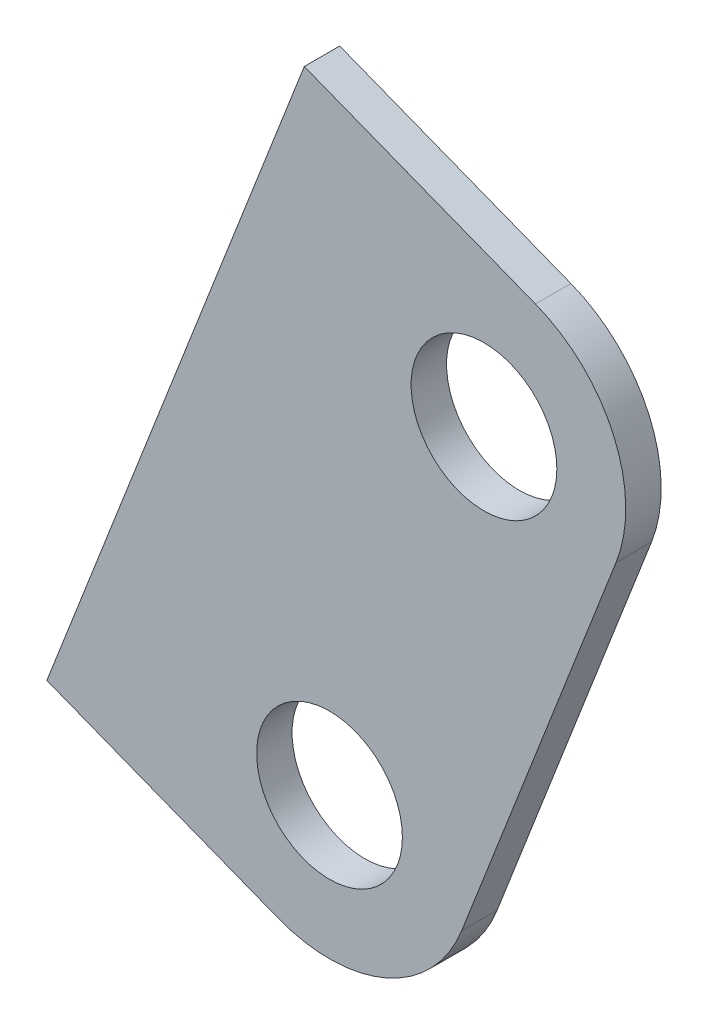
ISO-10303-21;
HEADER;
FILE_DESCRIPTION(('STEP AP214'),'2;1');
FILE_NAME('part.step','',(''),(''),'','','');
FILE_SCHEMA(('AUTOMOTIVE_DESIGN { 1 0 10303 214 1 1 1 1 }'));
ENDSEC;
DATA;
#1=APPLICATION_CONTEXT('core data for automotive mechanical design processes');
#2=APPLICATION_PROTOCOL_DEFINITION('international standard','automotive_design',2000,#1);
#3=PRODUCT_CONTEXT('',#1,'mechanical');
#4=PRODUCT('Part','Part','',(#3));
#5=PRODUCT_RELATED_PRODUCT_CATEGORY('part','',(#4));
#6=PRODUCT_DEFINITION_FORMATION('','',#4);
#7=PRODUCT_DEFINITION_CONTEXT('part definition',#1,'design');
#8=PRODUCT_DEFINITION('design','',#6,#7);
#9=PRODUCT_DEFINITION_SHAPE('','',#8);
#10=(LENGTH_UNIT() NAMED_UNIT(*) SI_UNIT(.MILLI.,.METRE.));
#11=(NAMED_UNIT(*) PLANE_ANGLE_UNIT() SI_UNIT($,.RADIAN.));
#12=(NAMED_UNIT(*) SI_UNIT($,.STERADIAN.) SOLID_ANGLE_UNIT());
#13=UNCERTAINTY_MEASURE_WITH_UNIT(LENGTH_MEASURE(1.E-05),#10,'distance_accuracy_value','');
#14=(GEOMETRIC_REPRESENTATION_CONTEXT(3) GLOBAL_UNCERTAINTY_ASSIGNED_CONTEXT((#13)) GLOBAL_UNIT_ASSIGNED_CONTEXT((#10,
#11,#12)) REPRESENTATION_CONTEXT('',''));
#15=CARTESIAN_POINT('',(0.,0.,0.));
#16=DIRECTION('',(0.,0.,1.));
#17=DIRECTION('',(1.,0.,0.));
#18=AXIS2_PLACEMENT_3D('',#15,#16,#17);
#19=CARTESIAN_POINT('',(-57.0329933903907,1075.8660329262,-138.90625));
#20=DIRECTION('',(0.,0.,-1.));
#21=DIRECTION('',(-1.,0.,0.));
#22=AXIS2_PLACEMENT_3D('',#19,#20,#21);
#23=PLANE('',#22);
#24=DIRECTION('',(-0.363182667764732,-0.931717956162321,0.));
#25=VECTOR('',#24,1.);
#26=CARTESIAN_POINT('',(-76.6115489394686,1056.23626423521,-138.90625));
#27=LINE('',#26,#25);
#28=CARTESIAN_POINT('',(-65.0804992379384,1085.81830934337,-138.90625));
#29=VERTEX_POINT('',#28);
#30=CARTESIAN_POINT('',(-76.6115489394686,1056.23626423521,-138.90625));
#31=VERTEX_POINT('',#30);
#32=EDGE_CURVE('E135',#29,#31,#27,.T.);
#33=ORIENTED_EDGE('',*,*,#32,.T.);
#34=DIRECTION('',(0.931717956162321,-0.363182667764732,0.));
#35=VECTOR('',#34,1.);
#36=CARTESIAN_POINT('',(-66.2578331516147,1052.20039683968,-138.90625));
#37=LINE('',#36,#35);
#38=CARTESIAN_POINT('',(-66.2578331516147,1052.20039683968,-138.90625));
#39=VERTEX_POINT('',#38);
#40=EDGE_CURVE('E93',#31,#39,#37,.T.);
#41=ORIENTED_EDGE('',*,*,#40,.T.);
#42=CARTESIAN_POINT('',(-63.9516232113088,1058.11680586131,-138.90625));
#43=DIRECTION('',(0.,0.,1.));
#44=DIRECTION('',(-1.,0.,0.));
#45=AXIS2_PLACEMENT_3D('',#42,#43,#44);
#46=CIRCLE('',#45,6.34999999999987);
#47=CARTESIAN_POINT('',(-58.0352141896781,1055.810595921,-138.90625));
#48=VERTEX_POINT('',#47);
#49=EDGE_CURVE('E106',#39,#48,#46,.T.);
#50=ORIENTED_EDGE('',*,*,#49,.T.);
#51=DIRECTION('',(0.36318266776473,0.931717956162321,0.));
#52=VECTOR('',#51,1.);
#53=CARTESIAN_POINT('',(-51.11658436876,1073.55982298589,-138.90625));
#54=LINE('',#53,#52);
#55=CARTESIAN_POINT('',(-51.1165843687601,1073.55982298589,-138.90625));
#56=VERTEX_POINT('',#55);
#57=EDGE_CURVE('E100',#48,#56,#54,.T.);
#58=ORIENTED_EDGE('',*,*,#57,.T.);
#59=CARTESIAN_POINT('',(-57.0329933903907,1075.8660329262,-138.90625));
#60=DIRECTION('',(0.,0.,1.));
#61=DIRECTION('',(-1.,0.,0.));
#62=AXIS2_PLACEMENT_3D('',#59,#60,#61);
#63=CIRCLE('',#62,6.34999999999979);
#64=CARTESIAN_POINT('',(-54.7267834500847,1081.78244194783,-138.90625));
#65=VERTEX_POINT('',#64);
#66=EDGE_CURVE('E104',#56,#65,#63,.T.);
#67=ORIENTED_EDGE('',*,*,#66,.T.);
#68=DIRECTION('',(-0.931717956162312,0.363182667764754,0.));
#69=VECTOR('',#68,1.);
#70=CARTESIAN_POINT('',(-65.0804992379384,1085.81830934337,-138.90625));
#71=LINE('',#70,#69);
#72=EDGE_CURVE('E56',#65,#29,#71,.T.);
#73=ORIENTED_EDGE('',*,*,#72,.T.);
#74=EDGE_LOOP('',(#33,#41,#50,#58,#67,#73));
#75=FACE_BOUND('',#74,.T.);
#76=CARTESIAN_POINT('',(-57.0329933903907,1075.8660329262,-138.90625));
#77=DIRECTION('',(0.,0.,1.));
#78=DIRECTION('',(1.,0.,0.));
#79=AXIS2_PLACEMENT_3D('',#76,#77,#78);
#80=CIRCLE('',#79,3.26390000000007);
#81=CARTESIAN_POINT('',(-53.7690933903906,1075.8660329262,-138.90625));
#82=VERTEX_POINT('',#81);
#83=EDGE_CURVE('E128',#82,#82,#80,.T.);
#84=ORIENTED_EDGE('',*,*,#83,.F.);
#85=EDGE_LOOP('',(#84));
#86=FACE_BOUND('',#85,.T.);
#87=CARTESIAN_POINT('',(-63.9516232113088,1058.11680586131,-138.90625));
#88=DIRECTION('',(0.,0.,1.));
#89=DIRECTION('',(1.,0.,0.));
#90=AXIS2_PLACEMENT_3D('',#87,#88,#89);
#91=CIRCLE('',#90,3.26390000000006);
#92=CARTESIAN_POINT('',(-60.6877232113088,1058.11680586131,-138.90625));
#93=VERTEX_POINT('',#92);
#94=EDGE_CURVE('E176',#93,#93,#91,.T.);
#95=ORIENTED_EDGE('',*,*,#94,.F.);
#96=EDGE_LOOP('',(#95));
#97=FACE_BOUND('',#96,.T.);
#98=ADVANCED_FACE('F39',(#75,#86,#97),#23,.F.);
#99=CARTESIAN_POINT('',(-57.0329933903907,1075.8660329262,-140.49375));
#100=DIRECTION('',(0.,0.,-1.));
#101=DIRECTION('',(-1.,0.,0.));
#102=AXIS2_PLACEMENT_3D('',#99,#100,#101);
#103=PLANE('',#102);
#104=CARTESIAN_POINT('',(-57.0329933903907,1075.8660329262,-140.49375));
#105=DIRECTION('',(0.,0.,1.));
#106=DIRECTION('',(1.,0.,0.));
#107=AXIS2_PLACEMENT_3D('',#104,#105,#106);
#108=CIRCLE('',#107,3.26390000000007);
#109=CARTESIAN_POINT('',(-53.7690933903906,1075.8660329262,-140.49375));
#110=VERTEX_POINT('',#109);
#111=EDGE_CURVE('E181',#110,#110,#108,.T.);
#112=ORIENTED_EDGE('',*,*,#111,.T.);
#113=EDGE_LOOP('',(#112));
#114=FACE_BOUND('',#113,.T.);
#115=DIRECTION('',(-0.363182667764732,-0.931717956162321,0.));
#116=VECTOR('',#115,1.);
#117=CARTESIAN_POINT('',(-76.6115489394686,1056.23626423521,-140.49375));
#118=LINE('',#117,#116);
#119=CARTESIAN_POINT('',(-65.0804992379384,1085.81830934337,-140.49375));
#120=VERTEX_POINT('',#119);
#121=CARTESIAN_POINT('',(-76.6115489394686,1056.23626423521,-140.49375));
#122=VERTEX_POINT('',#121);
#123=EDGE_CURVE('E124',#120,#122,#118,.T.);
#124=ORIENTED_EDGE('',*,*,#123,.F.);
#125=DIRECTION('',(-0.931717956162312,0.363182667764754,0.));
#126=VECTOR('',#125,1.);
#127=CARTESIAN_POINT('',(-65.0804992379384,1085.81830934337,-140.49375));
#128=LINE('',#127,#126);
#129=CARTESIAN_POINT('',(-54.7267834500847,1081.78244194783,-140.49375));
#130=VERTEX_POINT('',#129);
#131=EDGE_CURVE('E85',#130,#120,#128,.T.);
#132=ORIENTED_EDGE('',*,*,#131,.F.);
#133=CARTESIAN_POINT('',(-57.0329933903907,1075.8660329262,-140.49375));
#134=DIRECTION('',(0.,0.,1.));
#135=DIRECTION('',(-1.,0.,0.));
#136=AXIS2_PLACEMENT_3D('',#133,#134,#135);
#137=CIRCLE('',#136,6.34999999999979);
#138=CARTESIAN_POINT('',(-51.1165843687601,1073.55982298589,-140.49375));
#139=VERTEX_POINT('',#138);
#140=EDGE_CURVE('E79',#139,#130,#137,.T.);
#141=ORIENTED_EDGE('',*,*,#140,.F.);
#142=DIRECTION('',(0.36318266776473,0.931717956162321,0.));
#143=VECTOR('',#142,1.);
#144=CARTESIAN_POINT('',(-51.11658436876,1073.55982298589,-140.49375));
#145=LINE('',#144,#143);
#146=CARTESIAN_POINT('',(-58.0352141896781,1055.810595921,-140.49375));
#147=VERTEX_POINT('',#146);
#148=EDGE_CURVE('E114',#147,#139,#145,.T.);
#149=ORIENTED_EDGE('',*,*,#148,.F.);
#150=CARTESIAN_POINT('',(-63.9516232113088,1058.11680586131,-140.49375));
#151=DIRECTION('',(0.,0.,1.));
#152=DIRECTION('',(-1.,0.,0.));
#153=AXIS2_PLACEMENT_3D('',#150,#151,#152);
#154=CIRCLE('',#153,6.34999999999987);
#155=CARTESIAN_POINT('',(-66.2578331516147,1052.20039683968,-140.49375));
#156=VERTEX_POINT('',#155);
#157=EDGE_CURVE('E130',#156,#147,#154,.T.);
#158=ORIENTED_EDGE('',*,*,#157,.F.);
#159=DIRECTION('',(0.931717956162321,-0.363182667764732,0.));
#160=VECTOR('',#159,1.);
#161=CARTESIAN_POINT('',(-66.2578331516147,1052.20039683968,-140.49375));
#162=LINE('',#161,#160);
#163=EDGE_CURVE('E127',#122,#156,#162,.T.);
#164=ORIENTED_EDGE('',*,*,#163,.F.);
#165=EDGE_LOOP('',(#124,#132,#141,#149,#158,#164));
#166=FACE_BOUND('',#165,.T.);
#167=CARTESIAN_POINT('',(-63.9516232113088,1058.11680586131,-140.49375));
#168=DIRECTION('',(0.,0.,1.));
#169=DIRECTION('',(1.,0.,0.));
#170=AXIS2_PLACEMENT_3D('',#167,#168,#169);
#171=CIRCLE('',#170,3.26390000000006);
#172=CARTESIAN_POINT('',(-60.6877232113088,1058.11680586131,-140.49375));
#173=VERTEX_POINT('',#172);
#174=EDGE_CURVE('E179',#173,#173,#171,.T.);
#175=ORIENTED_EDGE('',*,*,#174,.T.);
#176=EDGE_LOOP('',(#175));
#177=FACE_BOUND('',#176,.T.);
#178=ADVANCED_FACE('F144',(#114,#166,#177),#103,.T.);
#179=CARTESIAN_POINT('',(-76.6115489394686,1056.23626423521,-138.90625));
#180=DIRECTION('',(0.931717956162321,-0.363182667764732,0.));
#181=DIRECTION('',(0.363182667764732,0.931717956162321,0.));
#182=AXIS2_PLACEMENT_3D('',#179,#180,#181);
#183=PLANE('',#182);
#184=ORIENTED_EDGE('',*,*,#123,.T.);
#185=DIRECTION('',(0.,0.,-1.));
#186=VECTOR('',#185,1.);
#187=CARTESIAN_POINT('',(-76.6115489394686,1056.23626423521,-138.90625));
#188=LINE('',#187,#186);
#189=EDGE_CURVE('E11',#31,#122,#188,.T.);
#190=ORIENTED_EDGE('',*,*,#189,.F.);
#191=ORIENTED_EDGE('',*,*,#32,.F.);
#192=DIRECTION('',(0.,0.,-1.));
#193=VECTOR('',#192,1.);
#194=CARTESIAN_POINT('',(-65.0804992379384,1085.81830934337,-138.90625));
#195=LINE('',#194,#193);
#196=EDGE_CURVE('E120',#29,#120,#195,.T.);
#197=ORIENTED_EDGE('',*,*,#196,.T.);
#198=EDGE_LOOP('',(#184,#190,#191,#197));
#199=FACE_BOUND('',#198,.T.);
#200=ADVANCED_FACE('F41',(#199),#183,.F.);
#201=CARTESIAN_POINT('',(-66.2578331516147,1052.20039683968,-138.90625));
#202=DIRECTION('',(0.363182667764732,0.931717956162321,0.));
#203=DIRECTION('',(-0.931717956162321,0.363182667764733,0.));
#204=AXIS2_PLACEMENT_3D('',#201,#202,#203);
#205=PLANE('',#204);
#206=ORIENTED_EDGE('',*,*,#163,.T.);
#207=DIRECTION('',(0.,0.,-1.));
#208=VECTOR('',#207,1.);
#209=CARTESIAN_POINT('',(-66.2578331516147,1052.20039683968,-138.90625));
#210=LINE('',#209,#208);
#211=EDGE_CURVE('E48',#39,#156,#210,.T.);
#212=ORIENTED_EDGE('',*,*,#211,.F.);
#213=ORIENTED_EDGE('',*,*,#40,.F.);
#214=ORIENTED_EDGE('',*,*,#189,.T.);
#215=EDGE_LOOP('',(#206,#212,#213,#214));
#216=FACE_BOUND('',#215,.T.);
#217=ADVANCED_FACE('F226',(#216),#205,.F.);
#218=CARTESIAN_POINT('',(-63.9516232113088,1058.11680586131,-138.90625));
#219=DIRECTION('',(0.,0.,-1.));
#220=DIRECTION('',(-1.,0.,0.));
#221=AXIS2_PLACEMENT_3D('',#218,#219,#220);
#222=CYLINDRICAL_SURFACE('',#221,6.34999999999987);
#223=ORIENTED_EDGE('',*,*,#157,.T.);
#224=DIRECTION('',(0.,0.,-1.));
#225=VECTOR('',#224,1.);
#226=CARTESIAN_POINT('',(-58.0352141896781,1055.810595921,-138.90625));
#227=LINE('',#226,#225);
#228=EDGE_CURVE('E115',#48,#147,#227,.T.);
#229=ORIENTED_EDGE('',*,*,#228,.F.);
#230=ORIENTED_EDGE('',*,*,#49,.F.);
#231=ORIENTED_EDGE('',*,*,#211,.T.);
#232=EDGE_LOOP('',(#223,#229,#230,#231));
#233=FACE_BOUND('',#232,.T.);
#234=ADVANCED_FACE('F141',(#233),#222,.T.);
#235=CARTESIAN_POINT('',(-51.11658436876,1073.55982298589,-138.90625));
#236=DIRECTION('',(-0.931717956162322,0.36318266776473,0.));
#237=DIRECTION('',(-0.36318266776473,-0.931717956162322,0.));
#238=AXIS2_PLACEMENT_3D('',#235,#236,#237);
#239=PLANE('',#238);
#240=ORIENTED_EDGE('',*,*,#148,.T.);
#241=DIRECTION('',(0.,0.,-1.));
#242=VECTOR('',#241,1.);
#243=CARTESIAN_POINT('',(-51.1165843687601,1073.55982298589,-138.90625));
#244=LINE('',#243,#242);
#245=EDGE_CURVE('E111',#56,#139,#244,.T.);
#246=ORIENTED_EDGE('',*,*,#245,.F.);
#247=ORIENTED_EDGE('',*,*,#57,.F.);
#248=ORIENTED_EDGE('',*,*,#228,.T.);
#249=EDGE_LOOP('',(#240,#246,#247,#248));
#250=FACE_BOUND('',#249,.T.);
#251=ADVANCED_FACE('F112',(#250),#239,.F.);
#252=CARTESIAN_POINT('',(-57.0329933903907,1075.8660329262,-138.90625));
#253=DIRECTION('',(0.,0.,-1.));
#254=DIRECTION('',(-1.,0.,0.));
#255=AXIS2_PLACEMENT_3D('',#252,#253,#254);
#256=CYLINDRICAL_SURFACE('',#255,6.34999999999979);
#257=ORIENTED_EDGE('',*,*,#140,.T.);
#258=DIRECTION('',(0.,0.,-1.));
#259=VECTOR('',#258,1.);
#260=CARTESIAN_POINT('',(-54.7267834500847,1081.78244194783,-138.90625));
#261=LINE('',#260,#259);
#262=EDGE_CURVE('E116',#65,#130,#261,.T.);
#263=ORIENTED_EDGE('',*,*,#262,.F.);
#264=ORIENTED_EDGE('',*,*,#66,.F.);
#265=ORIENTED_EDGE('',*,*,#245,.T.);
#266=EDGE_LOOP('',(#257,#263,#264,#265));
#267=FACE_BOUND('',#266,.T.);
#268=ADVANCED_FACE('F118',(#267),#256,.T.);
#269=CARTESIAN_POINT('',(-65.0804992379384,1085.81830934337,-138.90625));
#270=DIRECTION('',(-0.363182667764754,-0.931717956162312,0.));
#271=DIRECTION('',(0.931717956162312,-0.363182667764754,0.));
#272=AXIS2_PLACEMENT_3D('',#269,#270,#271);
#273=PLANE('',#272);
#274=ORIENTED_EDGE('',*,*,#131,.T.);
#275=ORIENTED_EDGE('',*,*,#196,.F.);
#276=ORIENTED_EDGE('',*,*,#72,.F.);
#277=ORIENTED_EDGE('',*,*,#262,.T.);
#278=EDGE_LOOP('',(#274,#275,#276,#277));
#279=FACE_BOUND('',#278,.T.);
#280=ADVANCED_FACE('F149',(#279),#273,.F.);
#281=CARTESIAN_POINT('',(-57.0329933903907,1075.8660329262,-138.90625));
#282=DIRECTION('',(0.,0.,-1.));
#283=DIRECTION('',(-1.,0.,0.));
#284=AXIS2_PLACEMENT_3D('',#281,#282,#283);
#285=CYLINDRICAL_SURFACE('',#284,3.26390000000007);
#286=ORIENTED_EDGE('',*,*,#83,.T.);
#287=EDGE_LOOP('',(#286));
#288=FACE_BOUND('',#287,.T.);
#289=ORIENTED_EDGE('',*,*,#111,.F.);
#290=EDGE_LOOP('',(#289));
#291=FACE_BOUND('',#290,.T.);
#292=ADVANCED_FACE('F151',(#288,#291),#285,.F.);
#293=CARTESIAN_POINT('',(-63.9516232113088,1058.11680586131,-138.90625));
#294=DIRECTION('',(0.,0.,-1.));
#295=DIRECTION('',(-1.,0.,0.));
#296=AXIS2_PLACEMENT_3D('',#293,#294,#295);
#297=CYLINDRICAL_SURFACE('',#296,3.26390000000006);
#298=ORIENTED_EDGE('',*,*,#94,.T.);
#299=EDGE_LOOP('',(#298));
#300=FACE_BOUND('',#299,.T.);
#301=ORIENTED_EDGE('',*,*,#174,.F.);
#302=EDGE_LOOP('',(#301));
#303=FACE_BOUND('',#302,.T.);
#304=ADVANCED_FACE('F157',(#300,#303),#297,.F.);
#305=CLOSED_SHELL('',(#98,#178,#200,#217,#234,#251,#268,#280,#292,#304));
#306=MANIFOLD_SOLID_BREP('B2',#305);
#307=ADVANCED_BREP_SHAPE_REPRESENTATION('',(#18,#306),#14);
#308=SHAPE_DEFINITION_REPRESENTATION(#9,#307);
ENDSEC;
END-ISO-10303-21;
